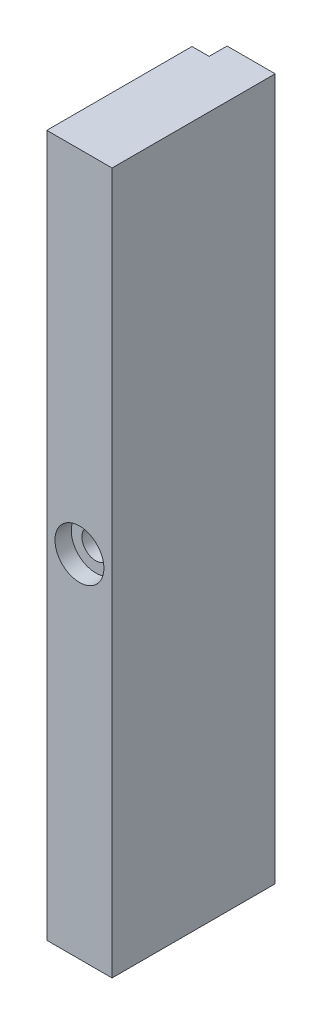
ISO-10303-21;
HEADER;
FILE_DESCRIPTION(('STEP AP214'),'2;1');
FILE_NAME('part.step','',(''),(''),'','','');
FILE_SCHEMA(('AUTOMOTIVE_DESIGN { 1 0 10303 214 1 1 1 1 }'));
ENDSEC;
DATA;
#1=APPLICATION_CONTEXT('core data for automotive mechanical design processes');
#2=APPLICATION_PROTOCOL_DEFINITION('international standard','automotive_design',2000,#1);
#3=PRODUCT_CONTEXT('',#1,'mechanical');
#4=PRODUCT('Part','Part','',(#3));
#5=PRODUCT_RELATED_PRODUCT_CATEGORY('part','',(#4));
#6=PRODUCT_DEFINITION_FORMATION('','',#4);
#7=PRODUCT_DEFINITION_CONTEXT('part definition',#1,'design');
#8=PRODUCT_DEFINITION('design','',#6,#7);
#9=PRODUCT_DEFINITION_SHAPE('','',#8);
#10=(LENGTH_UNIT() NAMED_UNIT(*) SI_UNIT(.MILLI.,.METRE.));
#11=(NAMED_UNIT(*) PLANE_ANGLE_UNIT() SI_UNIT($,.RADIAN.));
#12=(NAMED_UNIT(*) SI_UNIT($,.STERADIAN.) SOLID_ANGLE_UNIT());
#13=UNCERTAINTY_MEASURE_WITH_UNIT(LENGTH_MEASURE(1.E-05),#10,'distance_accuracy_value','');
#14=(GEOMETRIC_REPRESENTATION_CONTEXT(3) GLOBAL_UNCERTAINTY_ASSIGNED_CONTEXT((#13)) GLOBAL_UNIT_ASSIGNED_CONTEXT((#10,
#11,#12)) REPRESENTATION_CONTEXT('',''));
#15=CARTESIAN_POINT('',(0.,0.,0.));
#16=DIRECTION('',(0.,0.,1.));
#17=DIRECTION('',(1.,0.,0.));
#18=AXIS2_PLACEMENT_3D('',#15,#16,#17);
#19=CARTESIAN_POINT('',(-155.5,43.,138.));
#20=DIRECTION('',(-1.,0.,0.));
#21=DIRECTION('',(0.,0.,1.));
#22=AXIS2_PLACEMENT_3D('',#19,#20,#21);
#23=PLANE('',#22);
#24=DIRECTION('',(0.,-1.,0.));
#25=VECTOR('',#24,1.);
#26=CARTESIAN_POINT('',(-155.5,43.,140.));
#27=LINE('',#26,#25);
#28=CARTESIAN_POINT('',(-155.5,43.,140.));
#29=VERTEX_POINT('',#28);
#30=CARTESIAN_POINT('',(-155.5,-43.,140.));
#31=VERTEX_POINT('',#30);
#32=EDGE_CURVE('E134',#29,#31,#27,.T.);
#33=ORIENTED_EDGE('',*,*,#32,.F.);
#34=DIRECTION('',(0.,0.,1.));
#35=VECTOR('',#34,1.);
#36=CARTESIAN_POINT('',(-155.5,43.,138.));
#37=LINE('',#36,#35);
#38=CARTESIAN_POINT('',(-155.5,43.,122.2));
#39=VERTEX_POINT('',#38);
#40=EDGE_CURVE('E11',#39,#29,#37,.T.);
#41=ORIENTED_EDGE('',*,*,#40,.F.);
#42=DIRECTION('',(0.,-1.,0.));
#43=VECTOR('',#42,1.);
#44=CARTESIAN_POINT('',(-155.5,43.,122.2));
#45=LINE('',#44,#43);
#46=CARTESIAN_POINT('',(-155.5,-43.,122.2));
#47=VERTEX_POINT('',#46);
#48=EDGE_CURVE('E124',#39,#47,#45,.T.);
#49=ORIENTED_EDGE('',*,*,#48,.T.);
#50=DIRECTION('',(0.,0.,1.));
#51=VECTOR('',#50,1.);
#52=CARTESIAN_POINT('',(-155.5,-43.,138.));
#53=LINE('',#52,#51);
#54=EDGE_CURVE('E42',#47,#31,#53,.T.);
#55=ORIENTED_EDGE('',*,*,#54,.T.);
#56=EDGE_LOOP('',(#33,#41,#49,#55));
#57=FACE_BOUND('',#56,.T.);
#58=ADVANCED_FACE('F41',(#57),#23,.T.);
#59=CARTESIAN_POINT('',(-155.5,43.,138.));
#60=DIRECTION('',(0.,1.,0.));
#61=DIRECTION('',(0.,0.,1.));
#62=AXIS2_PLACEMENT_3D('',#59,#60,#61);
#63=PLANE('',#62);
#64=DIRECTION('',(-1.,0.,0.));
#65=VECTOR('',#64,1.);
#66=CARTESIAN_POINT('',(-155.5,43.,140.));
#67=LINE('',#66,#65);
#68=CARTESIAN_POINT('',(-147.5,43.,140.));
#69=VERTEX_POINT('',#68);
#70=EDGE_CURVE('E148',#69,#29,#67,.T.);
#71=ORIENTED_EDGE('',*,*,#70,.F.);
#72=DIRECTION('',(0.,0.,1.));
#73=VECTOR('',#72,1.);
#74=CARTESIAN_POINT('',(-147.5,43.,138.));
#75=LINE('',#74,#73);
#76=CARTESIAN_POINT('',(-147.5,43.,120.));
#77=VERTEX_POINT('',#76);
#78=EDGE_CURVE('E47',#77,#69,#75,.T.);
#79=ORIENTED_EDGE('',*,*,#78,.F.);
#80=DIRECTION('',(-1.,0.,0.));
#81=VECTOR('',#80,1.);
#82=CARTESIAN_POINT('',(-153.4,43.,120.));
#83=LINE('',#82,#81);
#84=CARTESIAN_POINT('',(-153.4,43.,120.));
#85=VERTEX_POINT('',#84);
#86=EDGE_CURVE('E106',#77,#85,#83,.T.);
#87=ORIENTED_EDGE('',*,*,#86,.T.);
#88=DIRECTION('',(0.,0.,1.));
#89=VECTOR('',#88,1.);
#90=CARTESIAN_POINT('',(-153.4,43.,120.));
#91=LINE('',#90,#89);
#92=CARTESIAN_POINT('',(-153.4,43.,122.2));
#93=VERTEX_POINT('',#92);
#94=EDGE_CURVE('E95',#85,#93,#91,.T.);
#95=ORIENTED_EDGE('',*,*,#94,.T.);
#96=DIRECTION('',(-1.,0.,0.));
#97=VECTOR('',#96,1.);
#98=CARTESIAN_POINT('',(-155.5,43.,122.2));
#99=LINE('',#98,#97);
#100=EDGE_CURVE('E129',#93,#39,#99,.T.);
#101=ORIENTED_EDGE('',*,*,#100,.T.);
#102=ORIENTED_EDGE('',*,*,#40,.T.);
#103=EDGE_LOOP('',(#71,#79,#87,#95,#101,#102));
#104=FACE_BOUND('',#103,.T.);
#105=ADVANCED_FACE('F112',(#104),#63,.T.);
#106=CARTESIAN_POINT('',(-147.5,43.,138.));
#107=DIRECTION('',(1.,0.,0.));
#108=DIRECTION('',(0.,0.,-1.));
#109=AXIS2_PLACEMENT_3D('',#106,#107,#108);
#110=PLANE('',#109);
#111=DIRECTION('',(0.,1.,0.));
#112=VECTOR('',#111,1.);
#113=CARTESIAN_POINT('',(-147.5,43.,140.));
#114=LINE('',#113,#112);
#115=CARTESIAN_POINT('',(-147.5,-43.,140.));
#116=VERTEX_POINT('',#115);
#117=EDGE_CURVE('E141',#116,#69,#114,.T.);
#118=ORIENTED_EDGE('',*,*,#117,.F.);
#119=DIRECTION('',(0.,0.,1.));
#120=VECTOR('',#119,1.);
#121=CARTESIAN_POINT('',(-147.5,-43.,138.));
#122=LINE('',#121,#120);
#123=CARTESIAN_POINT('',(-147.5,-43.,120.));
#124=VERTEX_POINT('',#123);
#125=EDGE_CURVE('E149',#124,#116,#122,.T.);
#126=ORIENTED_EDGE('',*,*,#125,.F.);
#127=DIRECTION('',(0.,1.,0.));
#128=VECTOR('',#127,1.);
#129=CARTESIAN_POINT('',(-147.5,43.,120.));
#130=LINE('',#129,#128);
#131=EDGE_CURVE('E97',#124,#77,#130,.T.);
#132=ORIENTED_EDGE('',*,*,#131,.T.);
#133=ORIENTED_EDGE('',*,*,#78,.T.);
#134=EDGE_LOOP('',(#118,#126,#132,#133));
#135=FACE_BOUND('',#134,.T.);
#136=ADVANCED_FACE('F159',(#135),#110,.T.);
#137=CARTESIAN_POINT('',(-155.5,-43.,138.));
#138=DIRECTION('',(0.,-1.,0.));
#139=DIRECTION('',(0.,0.,-1.));
#140=AXIS2_PLACEMENT_3D('',#137,#138,#139);
#141=PLANE('',#140);
#142=DIRECTION('',(1.,0.,0.));
#143=VECTOR('',#142,1.);
#144=CARTESIAN_POINT('',(-155.5,-43.,140.));
#145=LINE('',#144,#143);
#146=EDGE_CURVE('E140',#31,#116,#145,.T.);
#147=ORIENTED_EDGE('',*,*,#146,.F.);
#148=ORIENTED_EDGE('',*,*,#54,.F.);
#149=DIRECTION('',(1.,0.,0.));
#150=VECTOR('',#149,1.);
#151=CARTESIAN_POINT('',(-155.5,-43.,122.2));
#152=LINE('',#151,#150);
#153=CARTESIAN_POINT('',(-153.4,-43.,122.2));
#154=VERTEX_POINT('',#153);
#155=EDGE_CURVE('E127',#47,#154,#152,.T.);
#156=ORIENTED_EDGE('',*,*,#155,.T.);
#157=DIRECTION('',(0.,0.,1.));
#158=VECTOR('',#157,1.);
#159=CARTESIAN_POINT('',(-153.4,-43.,120.));
#160=LINE('',#159,#158);
#161=CARTESIAN_POINT('',(-153.4,-43.,120.));
#162=VERTEX_POINT('',#161);
#163=EDGE_CURVE('E60',#162,#154,#160,.T.);
#164=ORIENTED_EDGE('',*,*,#163,.F.);
#165=DIRECTION('',(1.,0.,0.));
#166=VECTOR('',#165,1.);
#167=CARTESIAN_POINT('',(-153.4,-43.,120.));
#168=LINE('',#167,#166);
#169=EDGE_CURVE('E108',#162,#124,#168,.T.);
#170=ORIENTED_EDGE('',*,*,#169,.T.);
#171=ORIENTED_EDGE('',*,*,#125,.T.);
#172=EDGE_LOOP('',(#147,#148,#156,#164,#170,#171));
#173=FACE_BOUND('',#172,.T.);
#174=ADVANCED_FACE('F156',(#173),#141,.T.);
#175=CARTESIAN_POINT('',(0.,0.,140.));
#176=DIRECTION('',(0.,0.,1.));
#177=DIRECTION('',(1.,0.,0.));
#178=AXIS2_PLACEMENT_3D('',#175,#176,#177);
#179=PLANE('',#178);
#180=CARTESIAN_POINT('',(-151.5,0.,140.));
#181=DIRECTION('',(0.,0.,1.));
#182=DIRECTION('',(1.,0.,0.));
#183=AXIS2_PLACEMENT_3D('',#180,#181,#182);
#184=CIRCLE('',#183,3.);
#185=CARTESIAN_POINT('',(-148.5,0.,140.));
#186=VERTEX_POINT('',#185);
#187=EDGE_CURVE('E131',#186,#186,#184,.T.);
#188=ORIENTED_EDGE('',*,*,#187,.F.);
#189=EDGE_LOOP('',(#188));
#190=FACE_BOUND('',#189,.T.);
#191=ORIENTED_EDGE('',*,*,#32,.T.);
#192=ORIENTED_EDGE('',*,*,#146,.T.);
#193=ORIENTED_EDGE('',*,*,#117,.T.);
#194=ORIENTED_EDGE('',*,*,#70,.T.);
#195=EDGE_LOOP('',(#191,#192,#193,#194));
#196=FACE_BOUND('',#195,.T.);
#197=ADVANCED_FACE('F158',(#190,#196),#179,.T.);
#198=CARTESIAN_POINT('',(-151.5,0.,138.));
#199=DIRECTION('',(0.,0.,1.));
#200=DIRECTION('',(1.,0.,0.));
#201=AXIS2_PLACEMENT_3D('',#198,#199,#200);
#202=CYLINDRICAL_SURFACE('',#201,3.);
#203=CARTESIAN_POINT('',(-151.5,0.,138.));
#204=DIRECTION('',(0.,0.,1.));
#205=DIRECTION('',(1.,0.,0.));
#206=AXIS2_PLACEMENT_3D('',#203,#204,#205);
#207=CIRCLE('',#206,3.);
#208=CARTESIAN_POINT('',(-148.5,0.,138.));
#209=VERTEX_POINT('',#208);
#210=EDGE_CURVE('E135',#209,#209,#207,.T.);
#211=ORIENTED_EDGE('',*,*,#210,.F.);
#212=EDGE_LOOP('',(#211));
#213=FACE_BOUND('',#212,.T.);
#214=ORIENTED_EDGE('',*,*,#187,.T.);
#215=EDGE_LOOP('',(#214));
#216=FACE_BOUND('',#215,.T.);
#217=ADVANCED_FACE('F173',(#213,#216),#202,.F.);
#218=CARTESIAN_POINT('',(0.,0.,138.));
#219=DIRECTION('',(0.,0.,1.));
#220=DIRECTION('',(1.,0.,0.));
#221=AXIS2_PLACEMENT_3D('',#218,#219,#220);
#222=PLANE('',#221);
#223=CARTESIAN_POINT('',(-151.5,0.,138.));
#224=DIRECTION('',(0.,0.,1.));
#225=DIRECTION('',(1.,0.,0.));
#226=AXIS2_PLACEMENT_3D('',#223,#224,#225);
#227=CIRCLE('',#226,1.70000000000001);
#228=CARTESIAN_POINT('',(-149.8,0.,138.));
#229=VERTEX_POINT('',#228);
#230=EDGE_CURVE('E118',#229,#229,#227,.T.);
#231=ORIENTED_EDGE('',*,*,#230,.F.);
#232=EDGE_LOOP('',(#231));
#233=FACE_BOUND('',#232,.T.);
#234=ORIENTED_EDGE('',*,*,#210,.T.);
#235=EDGE_LOOP('',(#234));
#236=FACE_BOUND('',#235,.T.);
#237=ADVANCED_FACE('F164',(#233,#236),#222,.T.);
#238=CARTESIAN_POINT('',(0.,0.,122.2));
#239=DIRECTION('',(0.,0.,1.));
#240=DIRECTION('',(1.,0.,0.));
#241=AXIS2_PLACEMENT_3D('',#238,#239,#240);
#242=PLANE('',#241);
#243=ORIENTED_EDGE('',*,*,#100,.F.);
#244=DIRECTION('',(0.,-1.,0.));
#245=VECTOR('',#244,1.);
#246=CARTESIAN_POINT('',(-153.4,43.,122.2));
#247=LINE('',#246,#245);
#248=EDGE_CURVE('E96',#93,#154,#247,.T.);
#249=ORIENTED_EDGE('',*,*,#248,.T.);
#250=ORIENTED_EDGE('',*,*,#155,.F.);
#251=ORIENTED_EDGE('',*,*,#48,.F.);
#252=EDGE_LOOP('',(#243,#249,#250,#251));
#253=FACE_BOUND('',#252,.T.);
#254=ADVANCED_FACE('F165',(#253),#242,.F.);
#255=CARTESIAN_POINT('',(-151.5,0.,122.2));
#256=DIRECTION('',(0.,0.,1.));
#257=DIRECTION('',(1.,0.,0.));
#258=AXIS2_PLACEMENT_3D('',#255,#256,#257);
#259=CYLINDRICAL_SURFACE('',#258,1.70000000000001);
#260=ORIENTED_EDGE('',*,*,#230,.T.);
#261=EDGE_LOOP('',(#260));
#262=FACE_BOUND('',#261,.T.);
#263=CARTESIAN_POINT('',(-151.5,0.,120.));
#264=DIRECTION('',(0.,0.,1.));
#265=DIRECTION('',(1.,0.,0.));
#266=AXIS2_PLACEMENT_3D('',#263,#264,#265);
#267=CIRCLE('',#266,1.70000000000001);
#268=CARTESIAN_POINT('',(-149.8,0.,120.));
#269=VERTEX_POINT('',#268);
#270=EDGE_CURVE('E114',#269,#269,#267,.T.);
#271=ORIENTED_EDGE('',*,*,#270,.F.);
#272=EDGE_LOOP('',(#271));
#273=FACE_BOUND('',#272,.T.);
#274=ADVANCED_FACE('F163',(#262,#273),#259,.F.);
#275=CARTESIAN_POINT('',(-153.4,43.,120.));
#276=DIRECTION('',(-1.,0.,0.));
#277=DIRECTION('',(0.,0.,1.));
#278=AXIS2_PLACEMENT_3D('',#275,#276,#277);
#279=PLANE('',#278);
#280=ORIENTED_EDGE('',*,*,#248,.F.);
#281=ORIENTED_EDGE('',*,*,#94,.F.);
#282=DIRECTION('',(0.,-1.,0.));
#283=VECTOR('',#282,1.);
#284=CARTESIAN_POINT('',(-153.4,43.,120.));
#285=LINE('',#284,#283);
#286=EDGE_CURVE('E92',#85,#162,#285,.T.);
#287=ORIENTED_EDGE('',*,*,#286,.T.);
#288=ORIENTED_EDGE('',*,*,#163,.T.);
#289=EDGE_LOOP('',(#280,#281,#287,#288));
#290=FACE_BOUND('',#289,.T.);
#291=ADVANCED_FACE('F94',(#290),#279,.T.);
#292=CARTESIAN_POINT('',(0.,0.,120.));
#293=DIRECTION('',(0.,0.,-1.));
#294=DIRECTION('',(-1.,0.,0.));
#295=AXIS2_PLACEMENT_3D('',#292,#293,#294);
#296=PLANE('',#295);
#297=ORIENTED_EDGE('',*,*,#270,.T.);
#298=EDGE_LOOP('',(#297));
#299=FACE_BOUND('',#298,.T.);
#300=ORIENTED_EDGE('',*,*,#86,.F.);
#301=ORIENTED_EDGE('',*,*,#131,.F.);
#302=ORIENTED_EDGE('',*,*,#169,.F.);
#303=ORIENTED_EDGE('',*,*,#286,.F.);
#304=EDGE_LOOP('',(#300,#301,#302,#303));
#305=FACE_BOUND('',#304,.T.);
#306=ADVANCED_FACE('F102',(#299,#305),#296,.T.);
#307=CLOSED_SHELL('',(#58,#105,#136,#174,#197,#217,#237,#254,#274,#291,#306));
#308=MANIFOLD_SOLID_BREP('B2',#307);
#309=ADVANCED_BREP_SHAPE_REPRESENTATION('',(#18,#308),#14);
#310=SHAPE_DEFINITION_REPRESENTATION(#9,#309);
ENDSEC;
END-ISO-10303-21;
